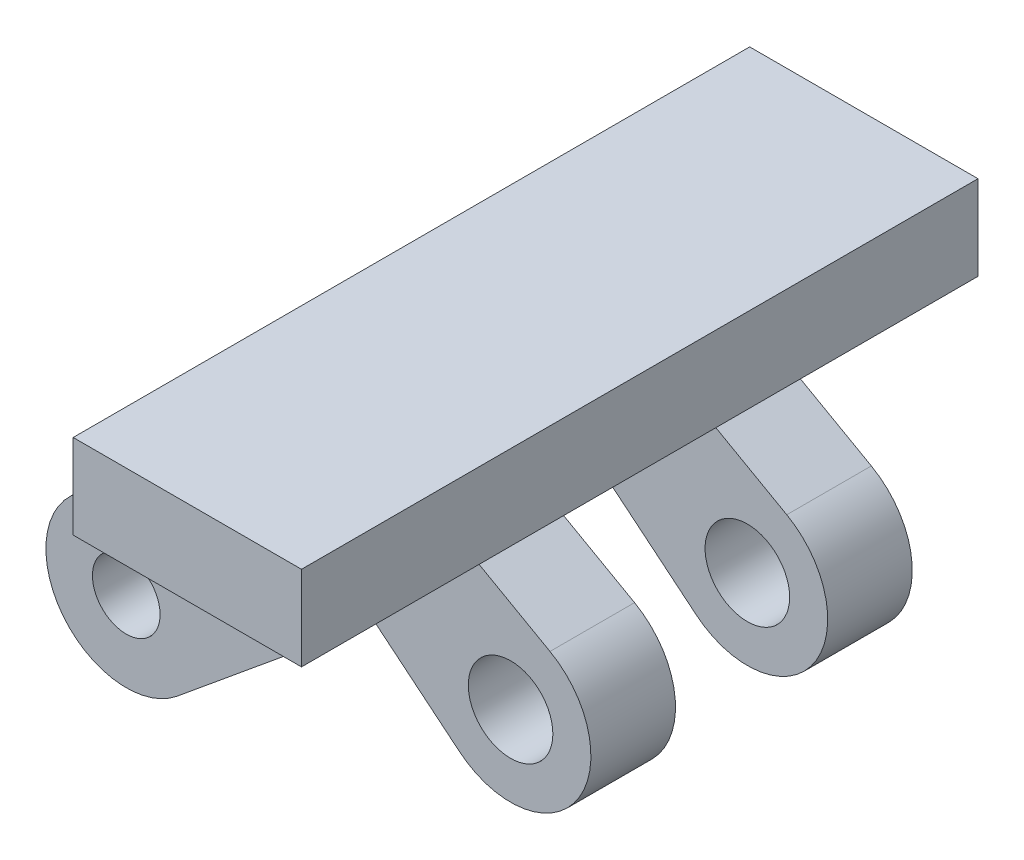
ISO-10303-21;
HEADER;
FILE_DESCRIPTION(('STEP AP214'),'2;1');
FILE_NAME('part.step','',(''),(''),'','','');
FILE_SCHEMA(('AUTOMOTIVE_DESIGN { 1 0 10303 214 1 1 1 1 }'));
ENDSEC;
DATA;
#1=APPLICATION_CONTEXT('core data for automotive mechanical design processes');
#2=APPLICATION_PROTOCOL_DEFINITION('international standard','automotive_design',2000,#1);
#3=PRODUCT_CONTEXT('',#1,'mechanical');
#4=PRODUCT('Part','Part','',(#3));
#5=PRODUCT_RELATED_PRODUCT_CATEGORY('part','',(#4));
#6=PRODUCT_DEFINITION_FORMATION('','',#4);
#7=PRODUCT_DEFINITION_CONTEXT('part definition',#1,'design');
#8=PRODUCT_DEFINITION('design','',#6,#7);
#9=PRODUCT_DEFINITION_SHAPE('','',#8);
#10=(LENGTH_UNIT() NAMED_UNIT(*) SI_UNIT(.MILLI.,.METRE.));
#11=(NAMED_UNIT(*) PLANE_ANGLE_UNIT() SI_UNIT($,.RADIAN.));
#12=(NAMED_UNIT(*) SI_UNIT($,.STERADIAN.) SOLID_ANGLE_UNIT());
#13=UNCERTAINTY_MEASURE_WITH_UNIT(LENGTH_MEASURE(1.E-05),#10,'distance_accuracy_value','');
#14=(GEOMETRIC_REPRESENTATION_CONTEXT(3) GLOBAL_UNCERTAINTY_ASSIGNED_CONTEXT((#13)) GLOBAL_UNIT_ASSIGNED_CONTEXT((#10,
#11,#12)) REPRESENTATION_CONTEXT('',''));
#15=CARTESIAN_POINT('',(0.,0.,0.));
#16=DIRECTION('',(0.,0.,1.));
#17=DIRECTION('',(1.,0.,0.));
#18=AXIS2_PLACEMENT_3D('',#15,#16,#17);
#19=CARTESIAN_POINT('',(0.,-2.,-8.));
#20=DIRECTION('',(0.,-1.,0.));
#21=DIRECTION('',(0.,0.,-1.));
#22=AXIS2_PLACEMENT_3D('',#19,#20,#21);
#23=PLANE('',#22);
#24=DIRECTION('',(0.,0.,1.));
#25=VECTOR('',#24,1.);
#26=CARTESIAN_POINT('',(0.,-2.,-8.));
#27=LINE('',#26,#25);
#28=CARTESIAN_POINT('',(0.,-2.,-1.8));
#29=VERTEX_POINT('',#28);
#30=CARTESIAN_POINT('',(0.,-2.,1.8));
#31=VERTEX_POINT('',#30);
#32=EDGE_CURVE('E59',#29,#31,#27,.T.);
#33=ORIENTED_EDGE('',*,*,#32,.F.);
#34=DIRECTION('',(1.,0.,0.));
#35=VECTOR('',#34,1.);
#36=CARTESIAN_POINT('',(0.,-2.,-1.8));
#37=LINE('',#36,#35);
#38=CARTESIAN_POINT('',(5.4,-2.,-1.8));
#39=VERTEX_POINT('',#38);
#40=EDGE_CURVE('E195',#29,#39,#37,.T.);
#41=ORIENTED_EDGE('',*,*,#40,.T.);
#42=DIRECTION('',(0.,0.,1.));
#43=VECTOR('',#42,1.);
#44=CARTESIAN_POINT('',(5.4,-2.,-8.));
#45=LINE('',#44,#43);
#46=CARTESIAN_POINT('',(5.4,-2.,1.8));
#47=VERTEX_POINT('',#46);
#48=EDGE_CURVE('E179',#39,#47,#45,.T.);
#49=ORIENTED_EDGE('',*,*,#48,.T.);
#50=DIRECTION('',(1.,0.,0.));
#51=VECTOR('',#50,1.);
#52=CARTESIAN_POINT('',(0.,-2.,1.8));
#53=LINE('',#52,#51);
#54=EDGE_CURVE('E285',#31,#47,#53,.T.);
#55=ORIENTED_EDGE('',*,*,#54,.F.);
#56=EDGE_LOOP('',(#33,#41,#49,#55));
#57=FACE_BOUND('',#56,.T.);
#58=ADVANCED_FACE('F41',(#57),#23,.T.);
#59=DIRECTION('',(1.,0.,0.));
#60=VECTOR('',#59,1.);
#61=CARTESIAN_POINT('',(0.,-2.,-3.8));
#62=LINE('',#61,#60);
#63=CARTESIAN_POINT('',(0.,-2.,-3.8));
#64=VERTEX_POINT('',#63);
#65=CARTESIAN_POINT('',(5.4,-2.,-3.8));
#66=VERTEX_POINT('',#65);
#67=EDGE_CURVE('E66',#64,#66,#62,.T.);
#68=ORIENTED_EDGE('',*,*,#67,.F.);
#69=CARTESIAN_POINT('',(0.,-2.,-4.));
#70=VERTEX_POINT('',#69);
#71=EDGE_CURVE('E379',#70,#64,#27,.T.);
#72=ORIENTED_EDGE('',*,*,#71,.F.);
#73=DIRECTION('',(1.,0.,0.));
#74=VECTOR('',#73,1.);
#75=CARTESIAN_POINT('',(0.,-2.,-4.));
#76=LINE('',#75,#74);
#77=CARTESIAN_POINT('',(5.4,-2.,-4.));
#78=VERTEX_POINT('',#77);
#79=EDGE_CURVE('E239',#70,#78,#76,.T.);
#80=ORIENTED_EDGE('',*,*,#79,.T.);
#81=EDGE_CURVE('E189',#78,#66,#45,.T.);
#82=ORIENTED_EDGE('',*,*,#81,.T.);
#83=EDGE_LOOP('',(#68,#72,#80,#82));
#84=FACE_BOUND('',#83,.T.);
#85=ADVANCED_FACE('F430',(#84),#23,.T.);
#86=DIRECTION('',(1.,0.,0.));
#87=VECTOR('',#86,1.);
#88=CARTESIAN_POINT('',(0.,-2.,-6.));
#89=LINE('',#88,#87);
#90=CARTESIAN_POINT('',(0.,-2.,-6.));
#91=VERTEX_POINT('',#90);
#92=CARTESIAN_POINT('',(5.4,-2.,-6.));
#93=VERTEX_POINT('',#92);
#94=EDGE_CURVE('E253',#91,#93,#89,.T.);
#95=ORIENTED_EDGE('',*,*,#94,.F.);
#96=CARTESIAN_POINT('',(0.,-2.,-8.));
#97=VERTEX_POINT('',#96);
#98=EDGE_CURVE('E44',#97,#91,#27,.T.);
#99=ORIENTED_EDGE('',*,*,#98,.F.);
#100=DIRECTION('',(1.,0.,0.));
#101=VECTOR('',#100,1.);
#102=CARTESIAN_POINT('',(0.,-2.,-8.));
#103=LINE('',#102,#101);
#104=CARTESIAN_POINT('',(5.4,-2.,-8.));
#105=VERTEX_POINT('',#104);
#106=EDGE_CURVE('E365',#97,#105,#103,.T.);
#107=ORIENTED_EDGE('',*,*,#106,.T.);
#108=EDGE_CURVE('E188',#105,#93,#45,.T.);
#109=ORIENTED_EDGE('',*,*,#108,.T.);
#110=EDGE_LOOP('',(#95,#99,#107,#109));
#111=FACE_BOUND('',#110,.T.);
#112=ADVANCED_FACE('F435',(#111),#23,.T.);
#113=CARTESIAN_POINT('',(0.,-2.,6.));
#114=VERTEX_POINT('',#113);
#115=CARTESIAN_POINT('',(0.,-2.,8.));
#116=VERTEX_POINT('',#115);
#117=EDGE_CURVE('E369',#114,#116,#27,.T.);
#118=ORIENTED_EDGE('',*,*,#117,.F.);
#119=DIRECTION('',(1.,0.,0.));
#120=VECTOR('',#119,1.);
#121=CARTESIAN_POINT('',(0.,-2.,6.));
#122=LINE('',#121,#120);
#123=CARTESIAN_POINT('',(5.4,-2.,6.));
#124=VERTEX_POINT('',#123);
#125=EDGE_CURVE('E335',#114,#124,#122,.T.);
#126=ORIENTED_EDGE('',*,*,#125,.T.);
#127=CARTESIAN_POINT('',(5.4,-2.,8.));
#128=VERTEX_POINT('',#127);
#129=EDGE_CURVE('E373',#124,#128,#45,.T.);
#130=ORIENTED_EDGE('',*,*,#129,.T.);
#131=DIRECTION('',(1.,0.,0.));
#132=VECTOR('',#131,1.);
#133=CARTESIAN_POINT('',(0.,-2.,8.));
#134=LINE('',#133,#132);
#135=EDGE_CURVE('E350',#116,#128,#134,.T.);
#136=ORIENTED_EDGE('',*,*,#135,.F.);
#137=EDGE_LOOP('',(#118,#126,#130,#136));
#138=FACE_BOUND('',#137,.T.);
#139=ADVANCED_FACE('F411',(#138),#23,.T.);
#140=CARTESIAN_POINT('',(0.,0.,-8.));
#141=DIRECTION('',(-1.,0.,0.));
#142=DIRECTION('',(0.,0.,1.));
#143=AXIS2_PLACEMENT_3D('',#140,#141,#142);
#144=PLANE('',#143);
#145=ORIENTED_EDGE('',*,*,#98,.T.);
#146=DIRECTION('',(0.,0.,-1.));
#147=VECTOR('',#146,1.);
#148=CARTESIAN_POINT('',(0.,-2.,-4.));
#149=LINE('',#148,#147);
#150=EDGE_CURVE('E255',#70,#91,#149,.T.);
#151=ORIENTED_EDGE('',*,*,#150,.F.);
#152=ORIENTED_EDGE('',*,*,#71,.T.);
#153=DIRECTION('',(0.,0.,-1.));
#154=VECTOR('',#153,1.);
#155=CARTESIAN_POINT('',(0.,-2.,-1.8));
#156=LINE('',#155,#154);
#157=EDGE_CURVE('E207',#29,#64,#156,.T.);
#158=ORIENTED_EDGE('',*,*,#157,.F.);
#159=ORIENTED_EDGE('',*,*,#32,.T.);
#160=DIRECTION('',(0.,0.,1.));
#161=VECTOR('',#160,1.);
#162=CARTESIAN_POINT('',(0.,-2.,1.8));
#163=LINE('',#162,#161);
#164=CARTESIAN_POINT('',(0.,-2.,3.8));
#165=VERTEX_POINT('',#164);
#166=EDGE_CURVE('E303',#31,#165,#163,.T.);
#167=ORIENTED_EDGE('',*,*,#166,.T.);
#168=CARTESIAN_POINT('',(0.,-2.,4.));
#169=VERTEX_POINT('',#168);
#170=EDGE_CURVE('E384',#165,#169,#27,.T.);
#171=ORIENTED_EDGE('',*,*,#170,.T.);
#172=DIRECTION('',(0.,0.,1.));
#173=VECTOR('',#172,1.);
#174=CARTESIAN_POINT('',(0.,-2.,4.));
#175=LINE('',#174,#173);
#176=EDGE_CURVE('E336',#169,#114,#175,.T.);
#177=ORIENTED_EDGE('',*,*,#176,.T.);
#178=ORIENTED_EDGE('',*,*,#117,.T.);
#179=DIRECTION('',(0.,-1.,0.));
#180=VECTOR('',#179,1.);
#181=CARTESIAN_POINT('',(0.,0.,8.));
#182=LINE('',#181,#180);
#183=CARTESIAN_POINT('',(0.,0.,8.));
#184=VERTEX_POINT('',#183);
#185=EDGE_CURVE('E342',#184,#116,#182,.T.);
#186=ORIENTED_EDGE('',*,*,#185,.F.);
#187=DIRECTION('',(0.,0.,1.));
#188=VECTOR('',#187,1.);
#189=CARTESIAN_POINT('',(0.,0.,-8.));
#190=LINE('',#189,#188);
#191=CARTESIAN_POINT('',(0.,0.,-8.));
#192=VERTEX_POINT('',#191);
#193=EDGE_CURVE('E11',#192,#184,#190,.T.);
#194=ORIENTED_EDGE('',*,*,#193,.F.);
#195=DIRECTION('',(0.,-1.,0.));
#196=VECTOR('',#195,1.);
#197=CARTESIAN_POINT('',(0.,0.,-8.));
#198=LINE('',#197,#196);
#199=EDGE_CURVE('E360',#192,#97,#198,.T.);
#200=ORIENTED_EDGE('',*,*,#199,.T.);
#201=EDGE_LOOP('',(#145,#151,#152,#158,#159,#167,#171,#177,#178,#186,#194,#200));
#202=FACE_BOUND('',#201,.T.);
#203=ADVANCED_FACE('F43',(#202),#144,.T.);
#204=CARTESIAN_POINT('',(0.,0.,-8.));
#205=DIRECTION('',(0.,1.,0.));
#206=DIRECTION('',(0.,0.,1.));
#207=AXIS2_PLACEMENT_3D('',#204,#205,#206);
#208=PLANE('',#207);
#209=ORIENTED_EDGE('',*,*,#193,.T.);
#210=DIRECTION('',(-1.,0.,0.));
#211=VECTOR('',#210,1.);
#212=CARTESIAN_POINT('',(0.,0.,8.));
#213=LINE('',#212,#211);
#214=CARTESIAN_POINT('',(5.4,0.,8.));
#215=VERTEX_POINT('',#214);
#216=EDGE_CURVE('E358',#215,#184,#213,.T.);
#217=ORIENTED_EDGE('',*,*,#216,.F.);
#218=DIRECTION('',(0.,0.,1.));
#219=VECTOR('',#218,1.);
#220=CARTESIAN_POINT('',(5.4,0.,-8.));
#221=LINE('',#220,#219);
#222=CARTESIAN_POINT('',(5.4,0.,-8.));
#223=VERTEX_POINT('',#222);
#224=EDGE_CURVE('E49',#223,#215,#221,.T.);
#225=ORIENTED_EDGE('',*,*,#224,.F.);
#226=DIRECTION('',(-1.,0.,0.));
#227=VECTOR('',#226,1.);
#228=CARTESIAN_POINT('',(0.,0.,-8.));
#229=LINE('',#228,#227);
#230=EDGE_CURVE('E368',#223,#192,#229,.T.);
#231=ORIENTED_EDGE('',*,*,#230,.T.);
#232=EDGE_LOOP('',(#209,#217,#225,#231));
#233=FACE_BOUND('',#232,.T.);
#234=ADVANCED_FACE('F443',(#233),#208,.T.);
#235=CARTESIAN_POINT('',(5.4,0.,-8.));
#236=DIRECTION('',(1.,0.,0.));
#237=DIRECTION('',(0.,0.,-1.));
#238=AXIS2_PLACEMENT_3D('',#235,#236,#237);
#239=PLANE('',#238);
#240=ORIENTED_EDGE('',*,*,#224,.T.);
#241=DIRECTION('',(0.,1.,0.));
#242=VECTOR('',#241,1.);
#243=CARTESIAN_POINT('',(5.4,0.,8.));
#244=LINE('',#243,#242);
#245=EDGE_CURVE('E352',#128,#215,#244,.T.);
#246=ORIENTED_EDGE('',*,*,#245,.F.);
#247=ORIENTED_EDGE('',*,*,#129,.F.);
#248=DIRECTION('',(0.,0.,1.));
#249=VECTOR('',#248,1.);
#250=CARTESIAN_POINT('',(5.4,-2.,4.));
#251=LINE('',#250,#249);
#252=CARTESIAN_POINT('',(5.4,-2.,4.));
#253=VERTEX_POINT('',#252);
#254=EDGE_CURVE('E345',#253,#124,#251,.T.);
#255=ORIENTED_EDGE('',*,*,#254,.F.);
#256=CARTESIAN_POINT('',(5.4,-2.,3.8));
#257=VERTEX_POINT('',#256);
#258=EDGE_CURVE('E186',#257,#253,#45,.T.);
#259=ORIENTED_EDGE('',*,*,#258,.F.);
#260=DIRECTION('',(0.,0.,1.));
#261=VECTOR('',#260,1.);
#262=CARTESIAN_POINT('',(5.4,-2.,1.8));
#263=LINE('',#262,#261);
#264=EDGE_CURVE('E187',#47,#257,#263,.T.);
#265=ORIENTED_EDGE('',*,*,#264,.F.);
#266=ORIENTED_EDGE('',*,*,#48,.F.);
#267=DIRECTION('',(0.,0.,-1.));
#268=VECTOR('',#267,1.);
#269=CARTESIAN_POINT('',(5.4,-2.,-1.8));
#270=LINE('',#269,#268);
#271=EDGE_CURVE('E182',#39,#66,#270,.T.);
#272=ORIENTED_EDGE('',*,*,#271,.T.);
#273=ORIENTED_EDGE('',*,*,#81,.F.);
#274=DIRECTION('',(0.,0.,-1.));
#275=VECTOR('',#274,1.);
#276=CARTESIAN_POINT('',(5.4,-2.,-4.));
#277=LINE('',#276,#275);
#278=EDGE_CURVE('E275',#78,#93,#277,.T.);
#279=ORIENTED_EDGE('',*,*,#278,.T.);
#280=ORIENTED_EDGE('',*,*,#108,.F.);
#281=DIRECTION('',(0.,1.,0.));
#282=VECTOR('',#281,1.);
#283=CARTESIAN_POINT('',(5.4,0.,-8.));
#284=LINE('',#283,#282);
#285=EDGE_CURVE('E362',#105,#223,#284,.T.);
#286=ORIENTED_EDGE('',*,*,#285,.T.);
#287=EDGE_LOOP('',(#240,#246,#247,#255,#259,#265,#266,#272,#273,#279,#280,#286));
#288=FACE_BOUND('',#287,.T.);
#289=ADVANCED_FACE('F181',(#288),#239,.T.);
#290=DIRECTION('',(1.,0.,0.));
#291=VECTOR('',#290,1.);
#292=CARTESIAN_POINT('',(0.,-2.,3.8));
#293=LINE('',#292,#291);
#294=EDGE_CURVE('E299',#165,#257,#293,.T.);
#295=ORIENTED_EDGE('',*,*,#294,.T.);
#296=ORIENTED_EDGE('',*,*,#258,.T.);
#297=DIRECTION('',(1.,0.,0.));
#298=VECTOR('',#297,1.);
#299=CARTESIAN_POINT('',(0.,-2.,4.));
#300=LINE('',#299,#298);
#301=EDGE_CURVE('E316',#169,#253,#300,.T.);
#302=ORIENTED_EDGE('',*,*,#301,.F.);
#303=ORIENTED_EDGE('',*,*,#170,.F.);
#304=EDGE_LOOP('',(#295,#296,#302,#303));
#305=FACE_BOUND('',#304,.T.);
#306=ADVANCED_FACE('F392',(#305),#23,.T.);
#307=CARTESIAN_POINT('',(0.,0.,-8.));
#308=DIRECTION('',(0.,0.,1.));
#309=DIRECTION('',(1.,0.,0.));
#310=AXIS2_PLACEMENT_3D('',#307,#308,#309);
#311=PLANE('',#310);
#312=ORIENTED_EDGE('',*,*,#199,.F.);
#313=ORIENTED_EDGE('',*,*,#230,.F.);
#314=ORIENTED_EDGE('',*,*,#285,.F.);
#315=ORIENTED_EDGE('',*,*,#106,.F.);
#316=EDGE_LOOP('',(#312,#313,#314,#315));
#317=FACE_BOUND('',#316,.T.);
#318=ADVANCED_FACE('F434',(#317),#311,.F.);
#319=CARTESIAN_POINT('',(0.,0.,8.));
#320=DIRECTION('',(0.,0.,1.));
#321=DIRECTION('',(1.,0.,0.));
#322=AXIS2_PLACEMENT_3D('',#319,#320,#321);
#323=PLANE('',#322);
#324=ORIENTED_EDGE('',*,*,#185,.T.);
#325=ORIENTED_EDGE('',*,*,#135,.T.);
#326=ORIENTED_EDGE('',*,*,#245,.T.);
#327=ORIENTED_EDGE('',*,*,#216,.T.);
#328=EDGE_LOOP('',(#324,#325,#326,#327));
#329=FACE_BOUND('',#328,.T.);
#330=ADVANCED_FACE('F421',(#329),#323,.T.);
#331=CARTESIAN_POINT('',(0.855058757689388,-1.51853111854418,4.));
#332=DIRECTION('',(-0.490646961396796,0.871358456246389,0.));
#333=DIRECTION('',(-0.871358456246389,-0.490646961396796,0.));
#334=AXIS2_PLACEMENT_3D('',#331,#332,#333);
#335=PLANE('',#334);
#336=DIRECTION('',(-0.871358456246389,-0.490646961396796,0.));
#337=VECTOR('',#336,1.);
#338=CARTESIAN_POINT('',(0.855058757689388,-1.51853111854418,6.));
#339=LINE('',#338,#337);
#340=CARTESIAN_POINT('',(-1.67722922665391,-2.94441893313186,6.));
#341=VERTEX_POINT('',#340);
#342=EDGE_CURVE('E304',#114,#341,#339,.T.);
#343=ORIENTED_EDGE('',*,*,#342,.F.);
#344=ORIENTED_EDGE('',*,*,#176,.F.);
#345=DIRECTION('',(-0.871358456246389,-0.490646961396796,0.));
#346=VECTOR('',#345,1.);
#347=CARTESIAN_POINT('',(0.855058757689388,-1.51853111854418,4.));
#348=LINE('',#347,#346);
#349=CARTESIAN_POINT('',(-1.67722922665391,-2.94441893313186,4.));
#350=VERTEX_POINT('',#349);
#351=EDGE_CURVE('E309',#169,#350,#348,.T.);
#352=ORIENTED_EDGE('',*,*,#351,.T.);
#353=DIRECTION('',(0.,0.,1.));
#354=VECTOR('',#353,1.);
#355=CARTESIAN_POINT('',(-1.67722922665391,-2.94441893313186,4.));
#356=LINE('',#355,#354);
#357=EDGE_CURVE('E323',#350,#341,#356,.T.);
#358=ORIENTED_EDGE('',*,*,#357,.T.);
#359=EDGE_LOOP('',(#343,#344,#352,#358));
#360=FACE_BOUND('',#359,.T.);
#361=ADVANCED_FACE('F400',(#360),#335,.T.);
#362=CARTESIAN_POINT('',(3.16424227036864,-3.8415627943797,4.));
#363=DIRECTION('',(-0.635779364416676,0.771870843977105,0.));
#364=DIRECTION('',(-0.771870843977105,-0.635779364416676,0.));
#365=AXIS2_PLACEMENT_3D('',#362,#363,#364);
#366=PLANE('',#365);
#367=DIRECTION('',(-0.771870843977105,-0.635779364416676,0.));
#368=VECTOR('',#367,1.);
#369=CARTESIAN_POINT('',(3.16424227036864,-3.8415627943797,6.));
#370=LINE('',#369,#368);
#371=CARTESIAN_POINT('',(0.462980792391685,-6.0665546035565,6.));
#372=VERTEX_POINT('',#371);
#373=EDGE_CURVE('E333',#124,#372,#370,.T.);
#374=ORIENTED_EDGE('',*,*,#373,.T.);
#375=DIRECTION('',(0.,0.,1.));
#376=VECTOR('',#375,1.);
#377=CARTESIAN_POINT('',(0.462980792391685,-6.0665546035565,4.));
#378=LINE('',#377,#376);
#379=CARTESIAN_POINT('',(0.462980792391685,-6.0665546035565,4.));
#380=VERTEX_POINT('',#379);
#381=EDGE_CURVE('E343',#380,#372,#378,.T.);
#382=ORIENTED_EDGE('',*,*,#381,.F.);
#383=DIRECTION('',(-0.771870843977105,-0.635779364416676,0.));
#384=VECTOR('',#383,1.);
#385=CARTESIAN_POINT('',(3.16424227036864,-3.8415627943797,4.));
#386=LINE('',#385,#384);
#387=EDGE_CURVE('E320',#253,#380,#386,.T.);
#388=ORIENTED_EDGE('',*,*,#387,.F.);
#389=ORIENTED_EDGE('',*,*,#254,.T.);
#390=EDGE_LOOP('',(#374,#382,#388,#389));
#391=FACE_BOUND('',#390,.T.);
#392=ADVANCED_FACE('F413',(#391),#366,.F.);
#393=CARTESIAN_POINT('',(-0.744999999999999,-4.6,4.));
#394=DIRECTION('',(0.,0.,1.));
#395=DIRECTION('',(1.,0.,0.));
#396=AXIS2_PLACEMENT_3D('',#393,#394,#395);
#397=CYLINDRICAL_SURFACE('',#396,1.9);
#398=CARTESIAN_POINT('',(-0.744999999999999,-4.6,6.));
#399=DIRECTION('',(0.,0.,1.));
#400=DIRECTION('',(1.,0.,0.));
#401=AXIS2_PLACEMENT_3D('',#398,#399,#400);
#402=CIRCLE('',#401,1.9);
#403=EDGE_CURVE('E329',#341,#372,#402,.T.);
#404=ORIENTED_EDGE('',*,*,#403,.F.);
#405=ORIENTED_EDGE('',*,*,#357,.F.);
#406=CARTESIAN_POINT('',(-0.744999999999999,-4.6,4.));
#407=DIRECTION('',(0.,0.,1.));
#408=DIRECTION('',(1.,0.,0.));
#409=AXIS2_PLACEMENT_3D('',#406,#407,#408);
#410=CIRCLE('',#409,1.9);
#411=EDGE_CURVE('E312',#350,#380,#410,.T.);
#412=ORIENTED_EDGE('',*,*,#411,.T.);
#413=ORIENTED_EDGE('',*,*,#381,.T.);
#414=EDGE_LOOP('',(#404,#405,#412,#413));
#415=FACE_BOUND('',#414,.T.);
#416=ADVANCED_FACE('F407',(#415),#397,.T.);
#417=CARTESIAN_POINT('',(-0.744999999999999,-4.6,4.));
#418=DIRECTION('',(0.,0.,1.));
#419=DIRECTION('',(1.,0.,0.));
#420=AXIS2_PLACEMENT_3D('',#417,#418,#419);
#421=CYLINDRICAL_SURFACE('',#420,0.8);
#422=CARTESIAN_POINT('',(-0.744999999999999,-4.6,4.));
#423=DIRECTION('',(0.,0.,1.));
#424=DIRECTION('',(1.,0.,0.));
#425=AXIS2_PLACEMENT_3D('',#422,#423,#424);
#426=CIRCLE('',#425,0.8);
#427=CARTESIAN_POINT('',(0.0550000000000009,-4.6,4.));
#428=VERTEX_POINT('',#427);
#429=EDGE_CURVE('E325',#428,#428,#426,.T.);
#430=ORIENTED_EDGE('',*,*,#429,.F.);
#431=EDGE_LOOP('',(#430));
#432=FACE_BOUND('',#431,.T.);
#433=CARTESIAN_POINT('',(-0.744999999999999,-4.6,6.));
#434=DIRECTION('',(0.,0.,1.));
#435=DIRECTION('',(1.,0.,0.));
#436=AXIS2_PLACEMENT_3D('',#433,#434,#435);
#437=CIRCLE('',#436,0.8);
#438=CARTESIAN_POINT('',(0.0550000000000009,-4.6,6.));
#439=VERTEX_POINT('',#438);
#440=EDGE_CURVE('E313',#439,#439,#437,.T.);
#441=ORIENTED_EDGE('',*,*,#440,.T.);
#442=EDGE_LOOP('',(#441));
#443=FACE_BOUND('',#442,.T.);
#444=ADVANCED_FACE('F423',(#432,#443),#421,.F.);
#445=CARTESIAN_POINT('',(0.,0.,4.));
#446=DIRECTION('',(0.,0.,1.));
#447=DIRECTION('',(1.,0.,0.));
#448=AXIS2_PLACEMENT_3D('',#445,#446,#447);
#449=PLANE('',#448);
#450=ORIENTED_EDGE('',*,*,#351,.F.);
#451=ORIENTED_EDGE('',*,*,#301,.T.);
#452=ORIENTED_EDGE('',*,*,#387,.T.);
#453=ORIENTED_EDGE('',*,*,#411,.F.);
#454=EDGE_LOOP('',(#450,#451,#452,#453));
#455=FACE_BOUND('',#454,.T.);
#456=ORIENTED_EDGE('',*,*,#429,.T.);
#457=EDGE_LOOP('',(#456));
#458=FACE_BOUND('',#457,.T.);
#459=ADVANCED_FACE('F402',(#455,#458),#449,.F.);
#460=CARTESIAN_POINT('',(0.,0.,6.));
#461=DIRECTION('',(0.,0.,1.));
#462=DIRECTION('',(1.,0.,0.));
#463=AXIS2_PLACEMENT_3D('',#460,#461,#462);
#464=PLANE('',#463);
#465=ORIENTED_EDGE('',*,*,#342,.T.);
#466=ORIENTED_EDGE('',*,*,#403,.T.);
#467=ORIENTED_EDGE('',*,*,#373,.F.);
#468=ORIENTED_EDGE('',*,*,#125,.F.);
#469=EDGE_LOOP('',(#465,#466,#467,#468));
#470=FACE_BOUND('',#469,.T.);
#471=ORIENTED_EDGE('',*,*,#440,.F.);
#472=EDGE_LOOP('',(#471));
#473=FACE_BOUND('',#472,.T.);
#474=ADVANCED_FACE('F406',(#470,#473),#464,.T.);
#475=CARTESIAN_POINT('',(-0.981479109191053,-1.19156919956386,1.8));
#476=DIRECTION('',(-0.635779364416676,-0.771870843977105,0.));
#477=DIRECTION('',(0.771870843977105,-0.635779364416676,0.));
#478=AXIS2_PLACEMENT_3D('',#475,#476,#477);
#479=PLANE('',#478);
#480=DIRECTION('',(0.771870843977105,-0.635779364416676,0.));
#481=VECTOR('',#480,1.);
#482=CARTESIAN_POINT('',(-0.981479109191053,-1.19156919956386,3.8));
#483=LINE('',#482,#481);
#484=CARTESIAN_POINT('',(4.93701920760832,-6.0665546035565,3.8));
#485=VERTEX_POINT('',#484);
#486=EDGE_CURVE('E270',#165,#485,#483,.T.);
#487=ORIENTED_EDGE('',*,*,#486,.F.);
#488=ORIENTED_EDGE('',*,*,#166,.F.);
#489=DIRECTION('',(0.771870843977105,-0.635779364416676,0.));
#490=VECTOR('',#489,1.);
#491=CARTESIAN_POINT('',(-0.981479109191053,-1.19156919956386,1.8));
#492=LINE('',#491,#490);
#493=CARTESIAN_POINT('',(4.93701920760832,-6.0665546035565,1.8));
#494=VERTEX_POINT('',#493);
#495=EDGE_CURVE('E277',#31,#494,#492,.T.);
#496=ORIENTED_EDGE('',*,*,#495,.T.);
#497=DIRECTION('',(0.,0.,1.));
#498=VECTOR('',#497,1.);
#499=CARTESIAN_POINT('',(4.93701920760832,-6.0665546035565,1.8));
#500=LINE('',#499,#498);
#501=EDGE_CURVE('E286',#494,#485,#500,.T.);
#502=ORIENTED_EDGE('',*,*,#501,.T.);
#503=EDGE_LOOP('',(#487,#488,#496,#502));
#504=FACE_BOUND('',#503,.T.);
#505=ADVANCED_FACE('F518',(#504),#479,.T.);
#506=CARTESIAN_POINT('',(0.444907222241319,0.790127527217163,1.8));
#507=DIRECTION('',(-0.490646961396795,-0.87135845624639,0.));
#508=DIRECTION('',(0.87135845624639,-0.490646961396795,0.));
#509=AXIS2_PLACEMENT_3D('',#506,#507,#508);
#510=PLANE('',#509);
#511=DIRECTION('',(0.87135845624639,-0.490646961396795,0.));
#512=VECTOR('',#511,1.);
#513=CARTESIAN_POINT('',(0.444907222241319,0.790127527217163,3.8));
#514=LINE('',#513,#512);
#515=CARTESIAN_POINT('',(7.07722922665391,-2.94441893313186,3.8));
#516=VERTEX_POINT('',#515);
#517=EDGE_CURVE('E298',#257,#516,#514,.T.);
#518=ORIENTED_EDGE('',*,*,#517,.T.);
#519=DIRECTION('',(0.,0.,1.));
#520=VECTOR('',#519,1.);
#521=CARTESIAN_POINT('',(7.07722922665391,-2.94441893313186,1.8));
#522=LINE('',#521,#520);
#523=CARTESIAN_POINT('',(7.07722922665391,-2.94441893313186,1.8));
#524=VERTEX_POINT('',#523);
#525=EDGE_CURVE('E310',#524,#516,#522,.T.);
#526=ORIENTED_EDGE('',*,*,#525,.F.);
#527=DIRECTION('',(0.87135845624639,-0.490646961396795,0.));
#528=VECTOR('',#527,1.);
#529=CARTESIAN_POINT('',(0.444907222241319,0.790127527217163,1.8));
#530=LINE('',#529,#528);
#531=EDGE_CURVE('E284',#47,#524,#530,.T.);
#532=ORIENTED_EDGE('',*,*,#531,.F.);
#533=ORIENTED_EDGE('',*,*,#264,.T.);
#534=EDGE_LOOP('',(#518,#526,#532,#533));
#535=FACE_BOUND('',#534,.T.);
#536=ADVANCED_FACE('F520',(#535),#510,.F.);
#537=CARTESIAN_POINT('',(6.145,-4.6,1.8));
#538=DIRECTION('',(0.,0.,1.));
#539=DIRECTION('',(1.,0.,0.));
#540=AXIS2_PLACEMENT_3D('',#537,#538,#539);
#541=CYLINDRICAL_SURFACE('',#540,1.9);
#542=CARTESIAN_POINT('',(6.145,-4.6,3.8));
#543=DIRECTION('',(0.,0.,1.));
#544=DIRECTION('',(1.,0.,0.));
#545=AXIS2_PLACEMENT_3D('',#542,#543,#544);
#546=CIRCLE('',#545,1.9);
#547=EDGE_CURVE('E291',#485,#516,#546,.T.);
#548=ORIENTED_EDGE('',*,*,#547,.F.);
#549=ORIENTED_EDGE('',*,*,#501,.F.);
#550=CARTESIAN_POINT('',(6.145,-4.6,1.8));
#551=DIRECTION('',(0.,0.,1.));
#552=DIRECTION('',(1.,0.,0.));
#553=AXIS2_PLACEMENT_3D('',#550,#551,#552);
#554=CIRCLE('',#553,1.9);
#555=EDGE_CURVE('E276',#494,#524,#554,.T.);
#556=ORIENTED_EDGE('',*,*,#555,.T.);
#557=ORIENTED_EDGE('',*,*,#525,.T.);
#558=EDGE_LOOP('',(#548,#549,#556,#557));
#559=FACE_BOUND('',#558,.T.);
#560=ADVANCED_FACE('F513',(#559),#541,.T.);
#561=CARTESIAN_POINT('',(6.145,-4.6,1.8));
#562=DIRECTION('',(0.,0.,1.));
#563=DIRECTION('',(1.,0.,0.));
#564=AXIS2_PLACEMENT_3D('',#561,#562,#563);
#565=CYLINDRICAL_SURFACE('',#564,1.);
#566=CARTESIAN_POINT('',(6.145,-4.6,1.8));
#567=DIRECTION('',(0.,0.,1.));
#568=DIRECTION('',(1.,0.,0.));
#569=AXIS2_PLACEMENT_3D('',#566,#567,#568);
#570=CIRCLE('',#569,1.);
#571=CARTESIAN_POINT('',(7.145,-4.6,1.8));
#572=VERTEX_POINT('',#571);
#573=EDGE_CURVE('E289',#572,#572,#570,.T.);
#574=ORIENTED_EDGE('',*,*,#573,.F.);
#575=EDGE_LOOP('',(#574));
#576=FACE_BOUND('',#575,.T.);
#577=CARTESIAN_POINT('',(6.145,-4.6,3.8));
#578=DIRECTION('',(0.,0.,1.));
#579=DIRECTION('',(1.,0.,0.));
#580=AXIS2_PLACEMENT_3D('',#577,#578,#579);
#581=CIRCLE('',#580,1.);
#582=CARTESIAN_POINT('',(7.145,-4.6,3.8));
#583=VERTEX_POINT('',#582);
#584=EDGE_CURVE('E278',#583,#583,#581,.T.);
#585=ORIENTED_EDGE('',*,*,#584,.T.);
#586=EDGE_LOOP('',(#585));
#587=FACE_BOUND('',#586,.T.);
#588=ADVANCED_FACE('F508',(#576,#587),#565,.F.);
#589=CARTESIAN_POINT('',(0.,0.,1.8));
#590=DIRECTION('',(0.,0.,1.));
#591=DIRECTION('',(1.,0.,0.));
#592=AXIS2_PLACEMENT_3D('',#589,#590,#591);
#593=PLANE('',#592);
#594=ORIENTED_EDGE('',*,*,#495,.F.);
#595=ORIENTED_EDGE('',*,*,#54,.T.);
#596=ORIENTED_EDGE('',*,*,#531,.T.);
#597=ORIENTED_EDGE('',*,*,#555,.F.);
#598=EDGE_LOOP('',(#594,#595,#596,#597));
#599=FACE_BOUND('',#598,.T.);
#600=ORIENTED_EDGE('',*,*,#573,.T.);
#601=EDGE_LOOP('',(#600));
#602=FACE_BOUND('',#601,.T.);
#603=ADVANCED_FACE('F506',(#599,#602),#593,.F.);
#604=CARTESIAN_POINT('',(0.,0.,3.8));
#605=DIRECTION('',(0.,0.,1.));
#606=DIRECTION('',(1.,0.,0.));
#607=AXIS2_PLACEMENT_3D('',#604,#605,#606);
#608=PLANE('',#607);
#609=ORIENTED_EDGE('',*,*,#486,.T.);
#610=ORIENTED_EDGE('',*,*,#547,.T.);
#611=ORIENTED_EDGE('',*,*,#517,.F.);
#612=ORIENTED_EDGE('',*,*,#294,.F.);
#613=EDGE_LOOP('',(#609,#610,#611,#612));
#614=FACE_BOUND('',#613,.T.);
#615=ORIENTED_EDGE('',*,*,#584,.F.);
#616=EDGE_LOOP('',(#615));
#617=FACE_BOUND('',#616,.T.);
#618=ADVANCED_FACE('F504',(#614,#617),#608,.T.);
#619=CARTESIAN_POINT('',(0.855058757689388,-1.51853111854418,-4.));
#620=DIRECTION('',(0.490646961396796,-0.871358456246389,0.));
#621=DIRECTION('',(0.871358456246389,0.490646961396796,0.));
#622=AXIS2_PLACEMENT_3D('',#619,#620,#621);
#623=PLANE('',#622);
#624=DIRECTION('',(-0.871358456246389,-0.490646961396796,0.));
#625=VECTOR('',#624,1.);
#626=CARTESIAN_POINT('',(0.855058757689388,-1.51853111854418,-6.));
#627=LINE('',#626,#625);
#628=CARTESIAN_POINT('',(-1.67722922665391,-2.94441893313186,-6.));
#629=VERTEX_POINT('',#628);
#630=EDGE_CURVE('E231',#91,#629,#627,.T.);
#631=ORIENTED_EDGE('',*,*,#630,.T.);
#632=DIRECTION('',(0.,0.,-1.));
#633=VECTOR('',#632,1.);
#634=CARTESIAN_POINT('',(-1.67722922665391,-2.94441893313186,-4.));
#635=LINE('',#634,#633);
#636=CARTESIAN_POINT('',(-1.67722922665391,-2.94441893313186,-4.));
#637=VERTEX_POINT('',#636);
#638=EDGE_CURVE('E268',#637,#629,#635,.T.);
#639=ORIENTED_EDGE('',*,*,#638,.F.);
#640=DIRECTION('',(-0.871358456246389,-0.490646961396796,0.));
#641=VECTOR('',#640,1.);
#642=CARTESIAN_POINT('',(0.855058757689388,-1.51853111854418,-4.));
#643=LINE('',#642,#641);
#644=EDGE_CURVE('E240',#70,#637,#643,.T.);
#645=ORIENTED_EDGE('',*,*,#644,.F.);
#646=ORIENTED_EDGE('',*,*,#150,.T.);
#647=EDGE_LOOP('',(#631,#639,#645,#646));
#648=FACE_BOUND('',#647,.T.);
#649=ADVANCED_FACE('F460',(#648),#623,.F.);
#650=CARTESIAN_POINT('',(-0.744999999999999,-4.6,-4.));
#651=DIRECTION('',(0.,0.,-1.));
#652=DIRECTION('',(-1.,0.,0.));
#653=AXIS2_PLACEMENT_3D('',#650,#651,#652);
#654=CYLINDRICAL_SURFACE('',#653,1.9);
#655=CARTESIAN_POINT('',(-0.744999999999999,-4.6,-6.));
#656=DIRECTION('',(0.,0.,1.));
#657=DIRECTION('',(1.,0.,0.));
#658=AXIS2_PLACEMENT_3D('',#655,#656,#657);
#659=CIRCLE('',#658,1.9);
#660=CARTESIAN_POINT('',(0.462980792391685,-6.0665546035565,-6.));
#661=VERTEX_POINT('',#660);
#662=EDGE_CURVE('E261',#629,#661,#659,.T.);
#663=ORIENTED_EDGE('',*,*,#662,.T.);
#664=DIRECTION('',(0.,0.,-1.));
#665=VECTOR('',#664,1.);
#666=CARTESIAN_POINT('',(0.462980792391685,-6.0665546035565,-4.));
#667=LINE('',#666,#665);
#668=CARTESIAN_POINT('',(0.462980792391685,-6.0665546035565,-4.));
#669=VERTEX_POINT('',#668);
#670=EDGE_CURVE('E266',#669,#661,#667,.T.);
#671=ORIENTED_EDGE('',*,*,#670,.F.);
#672=CARTESIAN_POINT('',(-0.744999999999999,-4.6,-4.));
#673=DIRECTION('',(0.,0.,1.));
#674=DIRECTION('',(1.,0.,0.));
#675=AXIS2_PLACEMENT_3D('',#672,#673,#674);
#676=CIRCLE('',#675,1.9);
#677=EDGE_CURVE('E250',#637,#669,#676,.T.);
#678=ORIENTED_EDGE('',*,*,#677,.F.);
#679=ORIENTED_EDGE('',*,*,#638,.T.);
#680=EDGE_LOOP('',(#663,#671,#678,#679));
#681=FACE_BOUND('',#680,.T.);
#682=ADVANCED_FACE('F496',(#681),#654,.T.);
#683=CARTESIAN_POINT('',(3.16424227036864,-3.8415627943797,-4.));
#684=DIRECTION('',(0.635779364416676,-0.771870843977105,0.));
#685=DIRECTION('',(0.771870843977105,0.635779364416676,0.));
#686=AXIS2_PLACEMENT_3D('',#683,#684,#685);
#687=PLANE('',#686);
#688=DIRECTION('',(-0.771870843977105,-0.635779364416676,0.));
#689=VECTOR('',#688,1.);
#690=CARTESIAN_POINT('',(3.16424227036864,-3.8415627943797,-6.));
#691=LINE('',#690,#689);
#692=EDGE_CURVE('E259',#93,#661,#691,.T.);
#693=ORIENTED_EDGE('',*,*,#692,.F.);
#694=ORIENTED_EDGE('',*,*,#278,.F.);
#695=DIRECTION('',(-0.771870843977105,-0.635779364416676,0.));
#696=VECTOR('',#695,1.);
#697=CARTESIAN_POINT('',(3.16424227036864,-3.8415627943797,-4.));
#698=LINE('',#697,#696);
#699=EDGE_CURVE('E242',#78,#669,#698,.T.);
#700=ORIENTED_EDGE('',*,*,#699,.T.);
#701=ORIENTED_EDGE('',*,*,#670,.T.);
#702=EDGE_LOOP('',(#693,#694,#700,#701));
#703=FACE_BOUND('',#702,.T.);
#704=ADVANCED_FACE('F494',(#703),#687,.T.);
#705=CARTESIAN_POINT('',(-0.744999999999999,-4.6,-4.));
#706=DIRECTION('',(0.,0.,-1.));
#707=DIRECTION('',(-1.,0.,0.));
#708=AXIS2_PLACEMENT_3D('',#705,#706,#707);
#709=CYLINDRICAL_SURFACE('',#708,0.8);
#710=CARTESIAN_POINT('',(-0.744999999999999,-4.6,-4.));
#711=DIRECTION('',(0.,0.,1.));
#712=DIRECTION('',(1.,0.,0.));
#713=AXIS2_PLACEMENT_3D('',#710,#711,#712);
#714=CIRCLE('',#713,0.8);
#715=CARTESIAN_POINT('',(0.0550000000000009,-4.6,-4.));
#716=VERTEX_POINT('',#715);
#717=EDGE_CURVE('E248',#716,#716,#714,.T.);
#718=ORIENTED_EDGE('',*,*,#717,.T.);
#719=EDGE_LOOP('',(#718));
#720=FACE_BOUND('',#719,.T.);
#721=CARTESIAN_POINT('',(-0.744999999999999,-4.6,-6.));
#722=DIRECTION('',(0.,0.,1.));
#723=DIRECTION('',(1.,0.,0.));
#724=AXIS2_PLACEMENT_3D('',#721,#722,#723);
#725=CIRCLE('',#724,0.8);
#726=CARTESIAN_POINT('',(0.0550000000000009,-4.6,-6.));
#727=VERTEX_POINT('',#726);
#728=EDGE_CURVE('E241',#727,#727,#725,.T.);
#729=ORIENTED_EDGE('',*,*,#728,.F.);
#730=EDGE_LOOP('',(#729));
#731=FACE_BOUND('',#730,.T.);
#732=ADVANCED_FACE('F486',(#720,#731),#709,.F.);
#733=CARTESIAN_POINT('',(0.,0.,-4.));
#734=DIRECTION('',(0.,0.,-1.));
#735=DIRECTION('',(1.,0.,0.));
#736=AXIS2_PLACEMENT_3D('',#733,#734,#735);
#737=PLANE('',#736);
#738=ORIENTED_EDGE('',*,*,#644,.T.);
#739=ORIENTED_EDGE('',*,*,#677,.T.);
#740=ORIENTED_EDGE('',*,*,#699,.F.);
#741=ORIENTED_EDGE('',*,*,#79,.F.);
#742=EDGE_LOOP('',(#738,#739,#740,#741));
#743=FACE_BOUND('',#742,.T.);
#744=ORIENTED_EDGE('',*,*,#717,.F.);
#745=EDGE_LOOP('',(#744));
#746=FACE_BOUND('',#745,.T.);
#747=ADVANCED_FACE('F481',(#743,#746),#737,.F.);
#748=CARTESIAN_POINT('',(0.,0.,-6.));
#749=DIRECTION('',(0.,0.,-1.));
#750=DIRECTION('',(1.,0.,0.));
#751=AXIS2_PLACEMENT_3D('',#748,#749,#750);
#752=PLANE('',#751);
#753=ORIENTED_EDGE('',*,*,#630,.F.);
#754=ORIENTED_EDGE('',*,*,#94,.T.);
#755=ORIENTED_EDGE('',*,*,#692,.T.);
#756=ORIENTED_EDGE('',*,*,#662,.F.);
#757=EDGE_LOOP('',(#753,#754,#755,#756));
#758=FACE_BOUND('',#757,.T.);
#759=ORIENTED_EDGE('',*,*,#728,.T.);
#760=EDGE_LOOP('',(#759));
#761=FACE_BOUND('',#760,.T.);
#762=ADVANCED_FACE('F456',(#758,#761),#752,.T.);
#763=CARTESIAN_POINT('',(-0.981479109191053,-1.19156919956386,-1.8));
#764=DIRECTION('',(0.635779364416676,0.771870843977105,0.));
#765=DIRECTION('',(-0.771870843977105,0.635779364416676,0.));
#766=AXIS2_PLACEMENT_3D('',#763,#764,#765);
#767=PLANE('',#766);
#768=DIRECTION('',(0.771870843977105,-0.635779364416676,0.));
#769=VECTOR('',#768,1.);
#770=CARTESIAN_POINT('',(-0.981479109191053,-1.19156919956386,-3.8));
#771=LINE('',#770,#769);
#772=CARTESIAN_POINT('',(4.93701920760832,-6.0665546035565,-3.8));
#773=VERTEX_POINT('',#772);
#774=EDGE_CURVE('E218',#64,#773,#771,.T.);
#775=ORIENTED_EDGE('',*,*,#774,.T.);
#776=DIRECTION('',(0.,0.,-1.));
#777=VECTOR('',#776,1.);
#778=CARTESIAN_POINT('',(4.93701920760832,-6.0665546035565,-1.8));
#779=LINE('',#778,#777);
#780=CARTESIAN_POINT('',(4.93701920760832,-6.0665546035565,-1.8));
#781=VERTEX_POINT('',#780);
#782=EDGE_CURVE('E229',#781,#773,#779,.T.);
#783=ORIENTED_EDGE('',*,*,#782,.F.);
#784=DIRECTION('',(0.771870843977105,-0.635779364416676,0.));
#785=VECTOR('',#784,1.);
#786=CARTESIAN_POINT('',(-0.981479109191053,-1.19156919956386,-1.8));
#787=LINE('',#786,#785);
#788=EDGE_CURVE('E197',#29,#781,#787,.T.);
#789=ORIENTED_EDGE('',*,*,#788,.F.);
#790=ORIENTED_EDGE('',*,*,#157,.T.);
#791=EDGE_LOOP('',(#775,#783,#789,#790));
#792=FACE_BOUND('',#791,.T.);
#793=ADVANCED_FACE('F467',(#792),#767,.F.);
#794=CARTESIAN_POINT('',(6.145,-4.6,-1.8));
#795=DIRECTION('',(0.,0.,-1.));
#796=DIRECTION('',(-1.,0.,0.));
#797=AXIS2_PLACEMENT_3D('',#794,#795,#796);
#798=CYLINDRICAL_SURFACE('',#797,1.9);
#799=CARTESIAN_POINT('',(6.145,-4.6,-3.8));
#800=DIRECTION('',(0.,0.,1.));
#801=DIRECTION('',(1.,0.,0.));
#802=AXIS2_PLACEMENT_3D('',#799,#800,#801);
#803=CIRCLE('',#802,1.9);
#804=CARTESIAN_POINT('',(7.07722922665391,-2.94441893313186,-3.8));
#805=VERTEX_POINT('',#804);
#806=EDGE_CURVE('E225',#773,#805,#803,.T.);
#807=ORIENTED_EDGE('',*,*,#806,.T.);
#808=DIRECTION('',(0.,0.,-1.));
#809=VECTOR('',#808,1.);
#810=CARTESIAN_POINT('',(7.07722922665391,-2.94441893313186,-1.8));
#811=LINE('',#810,#809);
#812=CARTESIAN_POINT('',(7.07722922665391,-2.94441893313186,-1.8));
#813=VERTEX_POINT('',#812);
#814=EDGE_CURVE('E201',#813,#805,#811,.T.);
#815=ORIENTED_EDGE('',*,*,#814,.F.);
#816=CARTESIAN_POINT('',(6.145,-4.6,-1.8));
#817=DIRECTION('',(0.,0.,1.));
#818=DIRECTION('',(1.,0.,0.));
#819=AXIS2_PLACEMENT_3D('',#816,#817,#818);
#820=CIRCLE('',#819,1.9);
#821=EDGE_CURVE('E208',#781,#813,#820,.T.);
#822=ORIENTED_EDGE('',*,*,#821,.F.);
#823=ORIENTED_EDGE('',*,*,#782,.T.);
#824=EDGE_LOOP('',(#807,#815,#822,#823));
#825=FACE_BOUND('',#824,.T.);
#826=ADVANCED_FACE('F475',(#825),#798,.T.);
#827=CARTESIAN_POINT('',(0.444907222241319,0.790127527217163,-1.8));
#828=DIRECTION('',(0.490646961396795,0.87135845624639,0.));
#829=DIRECTION('',(-0.87135845624639,0.490646961396795,0.));
#830=AXIS2_PLACEMENT_3D('',#827,#828,#829);
#831=PLANE('',#830);
#832=DIRECTION('',(0.87135845624639,-0.490646961396795,0.));
#833=VECTOR('',#832,1.);
#834=CARTESIAN_POINT('',(0.444907222241319,0.790127527217163,-3.8));
#835=LINE('',#834,#833);
#836=EDGE_CURVE('E205',#66,#805,#835,.T.);
#837=ORIENTED_EDGE('',*,*,#836,.F.);
#838=ORIENTED_EDGE('',*,*,#271,.F.);
#839=DIRECTION('',(0.87135845624639,-0.490646961396795,0.));
#840=VECTOR('',#839,1.);
#841=CARTESIAN_POINT('',(0.444907222241319,0.790127527217163,-1.8));
#842=LINE('',#841,#840);
#843=EDGE_CURVE('E196',#39,#813,#842,.T.);
#844=ORIENTED_EDGE('',*,*,#843,.T.);
#845=ORIENTED_EDGE('',*,*,#814,.T.);
#846=EDGE_LOOP('',(#837,#838,#844,#845));
#847=FACE_BOUND('',#846,.T.);
#848=ADVANCED_FACE('F204',(#847),#831,.T.);
#849=CARTESIAN_POINT('',(6.145,-4.6,-1.8));
#850=DIRECTION('',(0.,0.,-1.));
#851=DIRECTION('',(-1.,0.,0.));
#852=AXIS2_PLACEMENT_3D('',#849,#850,#851);
#853=CYLINDRICAL_SURFACE('',#852,1.);
#854=CARTESIAN_POINT('',(6.145,-4.6,-1.8));
#855=DIRECTION('',(0.,0.,1.));
#856=DIRECTION('',(1.,0.,0.));
#857=AXIS2_PLACEMENT_3D('',#854,#855,#856);
#858=CIRCLE('',#857,1.);
#859=CARTESIAN_POINT('',(7.145,-4.6,-1.8));
#860=VERTEX_POINT('',#859);
#861=EDGE_CURVE('E214',#860,#860,#858,.T.);
#862=ORIENTED_EDGE('',*,*,#861,.T.);
#863=EDGE_LOOP('',(#862));
#864=FACE_BOUND('',#863,.T.);
#865=CARTESIAN_POINT('',(6.145,-4.6,-3.8));
#866=DIRECTION('',(0.,0.,1.));
#867=DIRECTION('',(1.,0.,0.));
#868=AXIS2_PLACEMENT_3D('',#865,#866,#867);
#869=CIRCLE('',#868,1.);
#870=CARTESIAN_POINT('',(7.145,-4.6,-3.8));
#871=VERTEX_POINT('',#870);
#872=EDGE_CURVE('E227',#871,#871,#869,.T.);
#873=ORIENTED_EDGE('',*,*,#872,.F.);
#874=EDGE_LOOP('',(#873));
#875=FACE_BOUND('',#874,.T.);
#876=ADVANCED_FACE('F478',(#864,#875),#853,.F.);
#877=CARTESIAN_POINT('',(0.,0.,-1.8));
#878=DIRECTION('',(0.,0.,-1.));
#879=DIRECTION('',(1.,0.,0.));
#880=AXIS2_PLACEMENT_3D('',#877,#878,#879);
#881=PLANE('',#880);
#882=ORIENTED_EDGE('',*,*,#788,.T.);
#883=ORIENTED_EDGE('',*,*,#821,.T.);
#884=ORIENTED_EDGE('',*,*,#843,.F.);
#885=ORIENTED_EDGE('',*,*,#40,.F.);
#886=EDGE_LOOP('',(#882,#883,#884,#885));
#887=FACE_BOUND('',#886,.T.);
#888=ORIENTED_EDGE('',*,*,#861,.F.);
#889=EDGE_LOOP('',(#888));
#890=FACE_BOUND('',#889,.T.);
#891=ADVANCED_FACE('F206',(#887,#890),#881,.F.);
#892=CARTESIAN_POINT('',(0.,0.,-3.8));
#893=DIRECTION('',(0.,0.,-1.));
#894=DIRECTION('',(1.,0.,0.));
#895=AXIS2_PLACEMENT_3D('',#892,#893,#894);
#896=PLANE('',#895);
#897=ORIENTED_EDGE('',*,*,#774,.F.);
#898=ORIENTED_EDGE('',*,*,#67,.T.);
#899=ORIENTED_EDGE('',*,*,#836,.T.);
#900=ORIENTED_EDGE('',*,*,#806,.F.);
#901=EDGE_LOOP('',(#897,#898,#899,#900));
#902=FACE_BOUND('',#901,.T.);
#903=ORIENTED_EDGE('',*,*,#872,.T.);
#904=EDGE_LOOP('',(#903));
#905=FACE_BOUND('',#904,.T.);
#906=ADVANCED_FACE('F469',(#902,#905),#896,.T.);
#907=CLOSED_SHELL('',(#58,#85,#112,#139,#203,#234,#289,#306,#318,#330,#361,#392,#416,#444,#459,
#474,#505,#536,#560,#588,#603,#618,#649,#682,#704,#732,#747,#762,#793,#826,#848,#876,#891,#906));
#908=MANIFOLD_SOLID_BREP('B2',#907);
#909=ADVANCED_BREP_SHAPE_REPRESENTATION('',(#18,#908),#14);
#910=SHAPE_DEFINITION_REPRESENTATION(#9,#909);
ENDSEC;
END-ISO-10303-21;
